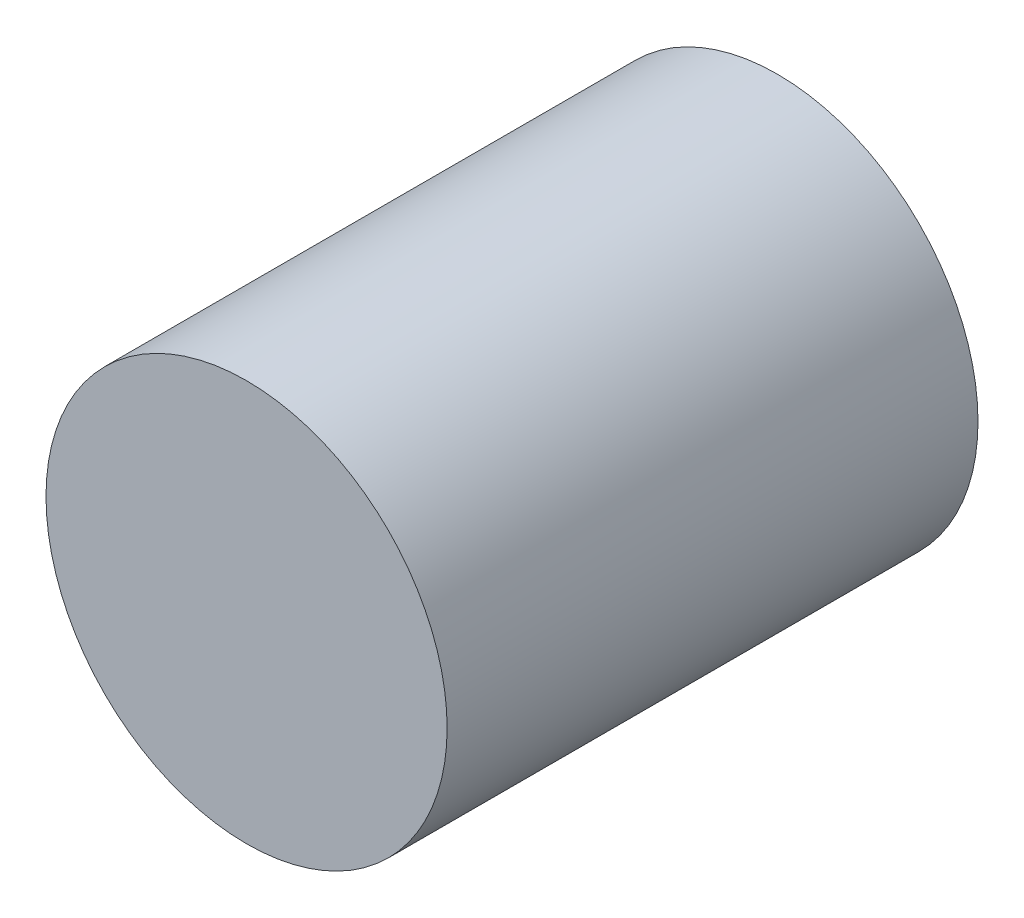
ISO-10303-21;
HEADER;
FILE_DESCRIPTION(('STEP AP214'),'2;1');
FILE_NAME('part.step','',(''),(''),'','','');
FILE_SCHEMA(('AUTOMOTIVE_DESIGN { 1 0 10303 214 1 1 1 1 }'));
ENDSEC;
DATA;
#1=APPLICATION_CONTEXT('core data for automotive mechanical design processes');
#2=APPLICATION_PROTOCOL_DEFINITION('international standard','automotive_design',2000,#1);
#3=PRODUCT_CONTEXT('',#1,'mechanical');
#4=PRODUCT('Part','Part','',(#3));
#5=PRODUCT_RELATED_PRODUCT_CATEGORY('part','',(#4));
#6=PRODUCT_DEFINITION_FORMATION('','',#4);
#7=PRODUCT_DEFINITION_CONTEXT('part definition',#1,'design');
#8=PRODUCT_DEFINITION('design','',#6,#7);
#9=PRODUCT_DEFINITION_SHAPE('','',#8);
#10=(LENGTH_UNIT() NAMED_UNIT(*) SI_UNIT(.MILLI.,.METRE.));
#11=(NAMED_UNIT(*) PLANE_ANGLE_UNIT() SI_UNIT($,.RADIAN.));
#12=(NAMED_UNIT(*) SI_UNIT($,.STERADIAN.) SOLID_ANGLE_UNIT());
#13=UNCERTAINTY_MEASURE_WITH_UNIT(LENGTH_MEASURE(1.E-05),#10,'distance_accuracy_value','');
#14=(GEOMETRIC_REPRESENTATION_CONTEXT(3) GLOBAL_UNCERTAINTY_ASSIGNED_CONTEXT((#13)) GLOBAL_UNIT_ASSIGNED_CONTEXT((#10,
#11,#12)) REPRESENTATION_CONTEXT('',''));
#15=CARTESIAN_POINT('',(0.,0.,0.));
#16=DIRECTION('',(0.,0.,1.));
#17=DIRECTION('',(1.,0.,0.));
#18=AXIS2_PLACEMENT_3D('',#15,#16,#17);
#19=CARTESIAN_POINT('',(0.,0.,100.));
#20=DIRECTION('',(0.,0.,-1.));
#21=DIRECTION('',(-1.,0.,0.));
#22=AXIS2_PLACEMENT_3D('',#19,#20,#21);
#23=CYLINDRICAL_SURFACE('',#22,37.7807435317197);
#24=CARTESIAN_POINT('',(0.,0.,100.));
#25=DIRECTION('',(0.,0.,1.));
#26=DIRECTION('',(1.,0.,0.));
#27=AXIS2_PLACEMENT_3D('',#24,#25,#26);
#28=CIRCLE('',#27,37.7807435317197);
#29=CARTESIAN_POINT('',(37.7807435317197,0.,100.));
#30=VERTEX_POINT('',#29);
#31=EDGE_CURVE('E10',#30,#30,#28,.T.);
#32=ORIENTED_EDGE('',*,*,#31,.F.);
#33=EDGE_LOOP('',(#32));
#34=FACE_BOUND('',#33,.T.);
#35=CARTESIAN_POINT('',(0.,0.,0.));
#36=DIRECTION('',(0.,0.,1.));
#37=DIRECTION('',(1.,0.,0.));
#38=AXIS2_PLACEMENT_3D('',#35,#36,#37);
#39=CIRCLE('',#38,37.7807435317197);
#40=CARTESIAN_POINT('',(37.7807435317197,0.,0.));
#41=VERTEX_POINT('',#40);
#42=EDGE_CURVE('E40',#41,#41,#39,.T.);
#43=ORIENTED_EDGE('',*,*,#42,.T.);
#44=EDGE_LOOP('',(#43));
#45=FACE_BOUND('',#44,.T.);
#46=ADVANCED_FACE('F37',(#34,#45),#23,.T.);
#47=CARTESIAN_POINT('',(0.,0.,100.));
#48=DIRECTION('',(0.,0.,1.));
#49=DIRECTION('',(1.,0.,0.));
#50=AXIS2_PLACEMENT_3D('',#47,#48,#49);
#51=PLANE('',#50);
#52=ORIENTED_EDGE('',*,*,#31,.T.);
#53=EDGE_LOOP('',(#52));
#54=FACE_BOUND('',#53,.T.);
#55=ADVANCED_FACE('F54',(#54),#51,.T.);
#56=CARTESIAN_POINT('',(0.,0.,0.));
#57=DIRECTION('',(0.,0.,1.));
#58=DIRECTION('',(1.,0.,0.));
#59=AXIS2_PLACEMENT_3D('',#56,#57,#58);
#60=PLANE('',#59);
#61=ORIENTED_EDGE('',*,*,#42,.F.);
#62=EDGE_LOOP('',(#61));
#63=FACE_BOUND('',#62,.T.);
#64=ADVANCED_FACE('F52',(#63),#60,.F.);
#65=CLOSED_SHELL('',(#46,#55,#64));
#66=MANIFOLD_SOLID_BREP('B2',#65);
#67=ADVANCED_BREP_SHAPE_REPRESENTATION('',(#18,#66),#14);
#68=SHAPE_DEFINITION_REPRESENTATION(#9,#67);
ENDSEC;
END-ISO-10303-21;
